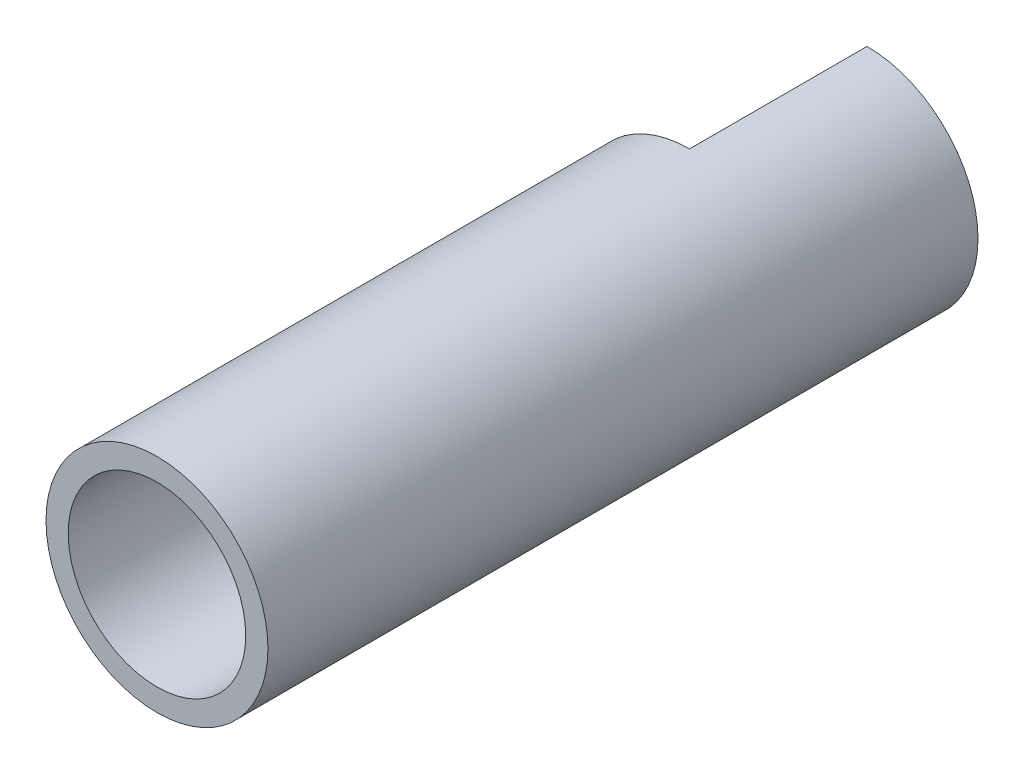
ISO-10303-21;
HEADER;
FILE_DESCRIPTION(('STEP AP214'),'2;1');
FILE_NAME('part.step','',(''),(''),'','','');
FILE_SCHEMA(('AUTOMOTIVE_DESIGN { 1 0 10303 214 1 1 1 1 }'));
ENDSEC;
DATA;
#1=APPLICATION_CONTEXT('core data for automotive mechanical design processes');
#2=APPLICATION_PROTOCOL_DEFINITION('international standard','automotive_design',2000,#1);
#3=PRODUCT_CONTEXT('',#1,'mechanical');
#4=PRODUCT('Part','Part','',(#3));
#5=PRODUCT_RELATED_PRODUCT_CATEGORY('part','',(#4));
#6=PRODUCT_DEFINITION_FORMATION('','',#4);
#7=PRODUCT_DEFINITION_CONTEXT('part definition',#1,'design');
#8=PRODUCT_DEFINITION('design','',#6,#7);
#9=PRODUCT_DEFINITION_SHAPE('','',#8);
#10=(LENGTH_UNIT() NAMED_UNIT(*) SI_UNIT(.MILLI.,.METRE.));
#11=(NAMED_UNIT(*) PLANE_ANGLE_UNIT() SI_UNIT($,.RADIAN.));
#12=(NAMED_UNIT(*) SI_UNIT($,.STERADIAN.) SOLID_ANGLE_UNIT());
#13=UNCERTAINTY_MEASURE_WITH_UNIT(LENGTH_MEASURE(1.E-05),#10,'distance_accuracy_value','');
#14=(GEOMETRIC_REPRESENTATION_CONTEXT(3) GLOBAL_UNCERTAINTY_ASSIGNED_CONTEXT((#13)) GLOBAL_UNIT_ASSIGNED_CONTEXT((#10,
#11,#12)) REPRESENTATION_CONTEXT('',''));
#15=CARTESIAN_POINT('',(0.,0.,0.));
#16=DIRECTION('',(0.,0.,1.));
#17=DIRECTION('',(1.,0.,0.));
#18=AXIS2_PLACEMENT_3D('',#15,#16,#17);
#19=CARTESIAN_POINT('',(0.,0.,0.));
#20=DIRECTION('',(0.,0.,1.));
#21=DIRECTION('',(1.,0.,0.));
#22=AXIS2_PLACEMENT_3D('',#19,#20,#21);
#23=PLANE('',#22);
#24=DIRECTION('',(0.,1.,0.));
#25=VECTOR('',#24,1.);
#26=CARTESIAN_POINT('',(0.,31.75,0.));
#27=LINE('',#26,#25);
#28=CARTESIAN_POINT('',(0.,25.4,0.));
#29=VERTEX_POINT('',#28);
#30=CARTESIAN_POINT('',(0.,31.75,0.));
#31=VERTEX_POINT('',#30);
#32=EDGE_CURVE('E99',#29,#31,#27,.T.);
#33=ORIENTED_EDGE('',*,*,#32,.T.);
#34=CARTESIAN_POINT('',(0.,0.,0.));
#35=DIRECTION('',(0.,0.,1.));
#36=DIRECTION('',(1.,0.,0.));
#37=AXIS2_PLACEMENT_3D('',#34,#35,#36);
#38=CIRCLE('',#37,31.75);
#39=CARTESIAN_POINT('',(0.,-31.75,0.));
#40=VERTEX_POINT('',#39);
#41=EDGE_CURVE('E42',#40,#31,#38,.T.);
#42=ORIENTED_EDGE('',*,*,#41,.F.);
#43=CARTESIAN_POINT('',(0.,-25.4,0.));
#44=VERTEX_POINT('',#43);
#45=EDGE_CURVE('E82',#40,#44,#27,.T.);
#46=ORIENTED_EDGE('',*,*,#45,.T.);
#47=CARTESIAN_POINT('',(0.,0.,0.));
#48=DIRECTION('',(0.,0.,1.));
#49=DIRECTION('',(1.,0.,0.));
#50=AXIS2_PLACEMENT_3D('',#47,#48,#49);
#51=CIRCLE('',#50,25.4);
#52=EDGE_CURVE('E95',#44,#29,#51,.T.);
#53=ORIENTED_EDGE('',*,*,#52,.T.);
#54=EDGE_LOOP('',(#33,#42,#46,#53));
#55=FACE_BOUND('',#54,.T.);
#56=ADVANCED_FACE('F38',(#55),#23,.F.);
#57=CARTESIAN_POINT('',(0.,0.,203.2));
#58=DIRECTION('',(0.,0.,-1.));
#59=DIRECTION('',(-1.,0.,0.));
#60=AXIS2_PLACEMENT_3D('',#57,#58,#59);
#61=CYLINDRICAL_SURFACE('',#60,31.75);
#62=CARTESIAN_POINT('',(0.,0.,203.2));
#63=DIRECTION('',(0.,0.,1.));
#64=DIRECTION('',(1.,0.,0.));
#65=AXIS2_PLACEMENT_3D('',#62,#63,#64);
#66=CIRCLE('',#65,31.75);
#67=CARTESIAN_POINT('',(31.75,0.,203.2));
#68=VERTEX_POINT('',#67);
#69=EDGE_CURVE('E11',#68,#68,#66,.T.);
#70=ORIENTED_EDGE('',*,*,#69,.F.);
#71=EDGE_LOOP('',(#70));
#72=FACE_BOUND('',#71,.T.);
#73=DIRECTION('',(0.,0.,1.));
#74=VECTOR('',#73,1.);
#75=CARTESIAN_POINT('',(0.,31.75,0.));
#76=LINE('',#75,#74);
#77=CARTESIAN_POINT('',(0.,31.75,50.8));
#78=VERTEX_POINT('',#77);
#79=EDGE_CURVE('E98',#31,#78,#76,.T.);
#80=ORIENTED_EDGE('',*,*,#79,.T.);
#81=CARTESIAN_POINT('',(0.,0.,50.8));
#82=DIRECTION('',(0.,0.,1.));
#83=DIRECTION('',(0.,-1.,0.));
#84=AXIS2_PLACEMENT_3D('',#81,#82,#83);
#85=CIRCLE('',#84,31.75);
#86=CARTESIAN_POINT('',(0.,-31.75,50.8));
#87=VERTEX_POINT('',#86);
#88=EDGE_CURVE('E119',#87,#78,#85,.F.);
#89=ORIENTED_EDGE('',*,*,#88,.F.);
#90=DIRECTION('',(0.,0.,-1.));
#91=VECTOR('',#90,1.);
#92=CARTESIAN_POINT('',(0.,-31.75,0.));
#93=LINE('',#92,#91);
#94=EDGE_CURVE('E89',#87,#40,#93,.T.);
#95=ORIENTED_EDGE('',*,*,#94,.T.);
#96=ORIENTED_EDGE('',*,*,#41,.T.);
#97=EDGE_LOOP('',(#80,#89,#95,#96));
#98=FACE_BOUND('',#97,.T.);
#99=ADVANCED_FACE('F40',(#72,#98),#61,.T.);
#100=CARTESIAN_POINT('',(0.,0.,203.2));
#101=DIRECTION('',(0.,0.,-1.));
#102=DIRECTION('',(-1.,0.,0.));
#103=AXIS2_PLACEMENT_3D('',#100,#101,#102);
#104=CYLINDRICAL_SURFACE('',#103,25.4);
#105=CARTESIAN_POINT('',(0.,0.,203.2));
#106=DIRECTION('',(0.,0.,1.));
#107=DIRECTION('',(1.,0.,0.));
#108=AXIS2_PLACEMENT_3D('',#105,#106,#107);
#109=CIRCLE('',#108,25.4);
#110=CARTESIAN_POINT('',(25.4,0.,203.2));
#111=VERTEX_POINT('',#110);
#112=EDGE_CURVE('E104',#111,#111,#109,.T.);
#113=ORIENTED_EDGE('',*,*,#112,.T.);
#114=EDGE_LOOP('',(#113));
#115=FACE_BOUND('',#114,.T.);
#116=CARTESIAN_POINT('',(0.,0.,50.8));
#117=DIRECTION('',(0.,0.,1.));
#118=DIRECTION('',(0.,-1.,0.));
#119=AXIS2_PLACEMENT_3D('',#116,#117,#118);
#120=CIRCLE('',#119,25.4);
#121=CARTESIAN_POINT('',(0.,-25.4,50.8));
#122=VERTEX_POINT('',#121);
#123=CARTESIAN_POINT('',(0.,25.4,50.8));
#124=VERTEX_POINT('',#123);
#125=EDGE_CURVE('E54',#122,#124,#120,.F.);
#126=ORIENTED_EDGE('',*,*,#125,.T.);
#127=DIRECTION('',(0.,0.,-1.));
#128=VECTOR('',#127,1.);
#129=CARTESIAN_POINT('',(0.,25.4,203.2));
#130=LINE('',#129,#128);
#131=EDGE_CURVE('E88',#29,#124,#130,.F.);
#132=ORIENTED_EDGE('',*,*,#131,.F.);
#133=ORIENTED_EDGE('',*,*,#52,.F.);
#134=DIRECTION('',(0.,0.,-1.));
#135=VECTOR('',#134,1.);
#136=CARTESIAN_POINT('',(0.,-25.4,203.2));
#137=LINE('',#136,#135);
#138=EDGE_CURVE('E79',#122,#44,#137,.T.);
#139=ORIENTED_EDGE('',*,*,#138,.F.);
#140=EDGE_LOOP('',(#126,#132,#133,#139));
#141=FACE_BOUND('',#140,.T.);
#142=ADVANCED_FACE('F102',(#115,#141),#104,.F.);
#143=CARTESIAN_POINT('',(0.,0.,203.2));
#144=DIRECTION('',(0.,0.,1.));
#145=DIRECTION('',(1.,0.,0.));
#146=AXIS2_PLACEMENT_3D('',#143,#144,#145);
#147=PLANE('',#146);
#148=ORIENTED_EDGE('',*,*,#69,.T.);
#149=EDGE_LOOP('',(#148));
#150=FACE_BOUND('',#149,.T.);
#151=ORIENTED_EDGE('',*,*,#112,.F.);
#152=EDGE_LOOP('',(#151));
#153=FACE_BOUND('',#152,.T.);
#154=ADVANCED_FACE('F136',(#150,#153),#147,.T.);
#155=CARTESIAN_POINT('',(-31.751,31.75,50.8));
#156=DIRECTION('',(0.,0.,1.));
#157=DIRECTION('',(0.,-1.,0.));
#158=AXIS2_PLACEMENT_3D('',#155,#156,#157);
#159=PLANE('',#158);
#160=ORIENTED_EDGE('',*,*,#88,.T.);
#161=DIRECTION('',(0.,-1.,0.));
#162=VECTOR('',#161,1.);
#163=CARTESIAN_POINT('',(0.,31.75,50.8));
#164=LINE('',#163,#162);
#165=EDGE_CURVE('E59',#78,#124,#164,.T.);
#166=ORIENTED_EDGE('',*,*,#165,.T.);
#167=ORIENTED_EDGE('',*,*,#125,.F.);
#168=EDGE_CURVE('E84',#122,#87,#164,.T.);
#169=ORIENTED_EDGE('',*,*,#168,.T.);
#170=EDGE_LOOP('',(#160,#166,#167,#169));
#171=FACE_BOUND('',#170,.T.);
#172=ADVANCED_FACE('F126',(#171),#159,.F.);
#173=CARTESIAN_POINT('',(0.,0.,0.));
#174=DIRECTION('',(-1.,0.,0.));
#175=DIRECTION('',(0.,0.,1.));
#176=AXIS2_PLACEMENT_3D('',#173,#174,#175);
#177=PLANE('',#176);
#178=ORIENTED_EDGE('',*,*,#131,.T.);
#179=ORIENTED_EDGE('',*,*,#165,.F.);
#180=ORIENTED_EDGE('',*,*,#79,.F.);
#181=ORIENTED_EDGE('',*,*,#32,.F.);
#182=EDGE_LOOP('',(#178,#179,#180,#181));
#183=FACE_BOUND('',#182,.T.);
#184=ADVANCED_FACE('F129',(#183),#177,.T.);
#185=ORIENTED_EDGE('',*,*,#138,.T.);
#186=ORIENTED_EDGE('',*,*,#45,.F.);
#187=ORIENTED_EDGE('',*,*,#94,.F.);
#188=ORIENTED_EDGE('',*,*,#168,.F.);
#189=EDGE_LOOP('',(#185,#186,#187,#188));
#190=FACE_BOUND('',#189,.T.);
#191=ADVANCED_FACE('F81',(#190),#177,.T.);
#192=CLOSED_SHELL('',(#56,#99,#142,#154,#172,#184,#191));
#193=MANIFOLD_SOLID_BREP('B2',#192);
#194=ADVANCED_BREP_SHAPE_REPRESENTATION('',(#18,#193),#14);
#195=SHAPE_DEFINITION_REPRESENTATION(#9,#194);
ENDSEC;
END-ISO-10303-21;
